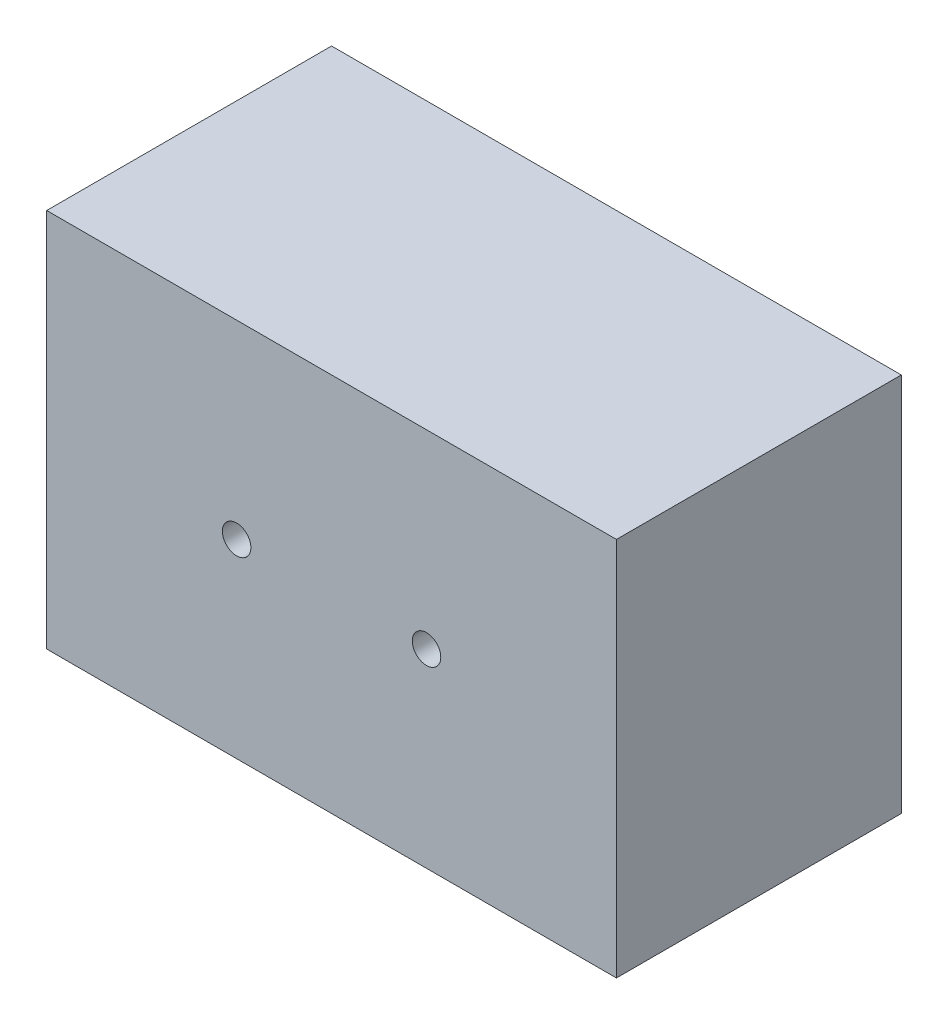
ISO-10303-21;
HEADER;
FILE_DESCRIPTION(('STEP AP214'),'2;1');
FILE_NAME('part.step','',(''),(''),'','','');
FILE_SCHEMA(('AUTOMOTIVE_DESIGN { 1 0 10303 214 1 1 1 1 }'));
ENDSEC;
DATA;
#1=APPLICATION_CONTEXT('core data for automotive mechanical design processes');
#2=APPLICATION_PROTOCOL_DEFINITION('international standard','automotive_design',2000,#1);
#3=PRODUCT_CONTEXT('',#1,'mechanical');
#4=PRODUCT('Part','Part','',(#3));
#5=PRODUCT_RELATED_PRODUCT_CATEGORY('part','',(#4));
#6=PRODUCT_DEFINITION_FORMATION('','',#4);
#7=PRODUCT_DEFINITION_CONTEXT('part definition',#1,'design');
#8=PRODUCT_DEFINITION('design','',#6,#7);
#9=PRODUCT_DEFINITION_SHAPE('','',#8);
#10=(LENGTH_UNIT() NAMED_UNIT(*) SI_UNIT(.MILLI.,.METRE.));
#11=(NAMED_UNIT(*) PLANE_ANGLE_UNIT() SI_UNIT($,.RADIAN.));
#12=(NAMED_UNIT(*) SI_UNIT($,.STERADIAN.) SOLID_ANGLE_UNIT());
#13=UNCERTAINTY_MEASURE_WITH_UNIT(LENGTH_MEASURE(1.E-05),#10,'distance_accuracy_value','');
#14=(GEOMETRIC_REPRESENTATION_CONTEXT(3) GLOBAL_UNCERTAINTY_ASSIGNED_CONTEXT((#13)) GLOBAL_UNIT_ASSIGNED_CONTEXT((#10,
#11,#12)) REPRESENTATION_CONTEXT('',''));
#15=CARTESIAN_POINT('',(0.,0.,0.));
#16=DIRECTION('',(0.,0.,1.));
#17=DIRECTION('',(1.,0.,0.));
#18=AXIS2_PLACEMENT_3D('',#15,#16,#17);
#19=CARTESIAN_POINT('',(10.,0.,0.));
#20=DIRECTION('',(0.,0.,-1.));
#21=DIRECTION('',(1.,0.,0.));
#22=AXIS2_PLACEMENT_3D('',#19,#20,#21);
#23=CYLINDRICAL_SURFACE('',#22,1.5);
#24=CARTESIAN_POINT('',(10.,0.,0.));
#25=DIRECTION('',(0.,0.,1.));
#26=DIRECTION('',(1.,0.,0.));
#27=AXIS2_PLACEMENT_3D('',#24,#25,#26);
#28=CIRCLE('',#27,1.5);
#29=CARTESIAN_POINT('',(11.5,0.,0.));
#30=VERTEX_POINT('',#29);
#31=EDGE_CURVE('E99',#30,#30,#28,.T.);
#32=ORIENTED_EDGE('',*,*,#31,.F.);
#33=DIRECTION('',(0.,0.,1.));
#34=VECTOR('',#33,1.);
#35=CARTESIAN_POINT('',(11.5,0.,0.));
#36=LINE('',#35,#34);
#37=CARTESIAN_POINT('',(11.5,0.,30.));
#38=VERTEX_POINT('',#37);
#39=EDGE_CURVE('E10',#30,#38,#36,.T.);
#40=ORIENTED_EDGE('',*,*,#39,.T.);
#41=CARTESIAN_POINT('',(10.,0.,30.));
#42=DIRECTION('',(0.,0.,-1.));
#43=DIRECTION('',(1.,0.,0.));
#44=AXIS2_PLACEMENT_3D('',#41,#42,#43);
#45=CIRCLE('',#44,1.5);
#46=EDGE_CURVE('E124',#38,#38,#45,.T.);
#47=ORIENTED_EDGE('',*,*,#46,.F.);
#48=ORIENTED_EDGE('',*,*,#39,.F.);
#49=EDGE_LOOP('',(#32,#40,#47,#48));
#50=FACE_BOUND('',#49,.T.);
#51=ADVANCED_FACE('F16',(#50),#23,.F.);
#52=CARTESIAN_POINT('',(-10.,0.,0.));
#53=DIRECTION('',(0.,0.,-1.));
#54=DIRECTION('',(1.,0.,0.));
#55=AXIS2_PLACEMENT_3D('',#52,#53,#54);
#56=CYLINDRICAL_SURFACE('',#55,1.5);
#57=CARTESIAN_POINT('',(-10.,0.,0.));
#58=DIRECTION('',(0.,0.,1.));
#59=DIRECTION('',(1.,0.,0.));
#60=AXIS2_PLACEMENT_3D('',#57,#58,#59);
#61=CIRCLE('',#60,1.5);
#62=CARTESIAN_POINT('',(-8.5,0.,0.));
#63=VERTEX_POINT('',#62);
#64=EDGE_CURVE('E129',#63,#63,#61,.T.);
#65=ORIENTED_EDGE('',*,*,#64,.F.);
#66=DIRECTION('',(0.,0.,1.));
#67=VECTOR('',#66,1.);
#68=CARTESIAN_POINT('',(-8.5,0.,0.));
#69=LINE('',#68,#67);
#70=CARTESIAN_POINT('',(-8.5,0.,30.));
#71=VERTEX_POINT('',#70);
#72=EDGE_CURVE('E25',#63,#71,#69,.T.);
#73=ORIENTED_EDGE('',*,*,#72,.T.);
#74=CARTESIAN_POINT('',(-10.,0.,30.));
#75=DIRECTION('',(0.,0.,-1.));
#76=DIRECTION('',(1.,0.,0.));
#77=AXIS2_PLACEMENT_3D('',#74,#75,#76);
#78=CIRCLE('',#77,1.5);
#79=EDGE_CURVE('E98',#71,#71,#78,.T.);
#80=ORIENTED_EDGE('',*,*,#79,.F.);
#81=ORIENTED_EDGE('',*,*,#72,.F.);
#82=EDGE_LOOP('',(#65,#73,#80,#81));
#83=FACE_BOUND('',#82,.T.);
#84=ADVANCED_FACE('F18',(#83),#56,.F.);
#85=CARTESIAN_POINT('',(30.,20.,0.));
#86=DIRECTION('',(0.,-1.,0.));
#87=DIRECTION('',(0.,0.,-1.));
#88=AXIS2_PLACEMENT_3D('',#85,#86,#87);
#89=PLANE('',#88);
#90=DIRECTION('',(-1.,0.,0.));
#91=VECTOR('',#90,1.);
#92=CARTESIAN_POINT('',(30.,20.,0.));
#93=LINE('',#92,#91);
#94=CARTESIAN_POINT('',(30.,20.,0.));
#95=VERTEX_POINT('',#94);
#96=CARTESIAN_POINT('',(-30.,20.,0.));
#97=VERTEX_POINT('',#96);
#98=EDGE_CURVE('E104',#95,#97,#93,.T.);
#99=ORIENTED_EDGE('',*,*,#98,.T.);
#100=DIRECTION('',(0.,0.,1.));
#101=VECTOR('',#100,1.);
#102=CARTESIAN_POINT('',(-30.,20.,0.));
#103=LINE('',#102,#101);
#104=CARTESIAN_POINT('',(-30.,20.,30.));
#105=VERTEX_POINT('',#104);
#106=EDGE_CURVE('E102',#97,#105,#103,.T.);
#107=ORIENTED_EDGE('',*,*,#106,.T.);
#108=DIRECTION('',(-1.,0.,0.));
#109=VECTOR('',#108,1.);
#110=CARTESIAN_POINT('',(30.,20.,30.));
#111=LINE('',#110,#109);
#112=CARTESIAN_POINT('',(30.,20.,30.));
#113=VERTEX_POINT('',#112);
#114=EDGE_CURVE('E86',#113,#105,#111,.T.);
#115=ORIENTED_EDGE('',*,*,#114,.F.);
#116=DIRECTION('',(0.,0.,1.));
#117=VECTOR('',#116,1.);
#118=CARTESIAN_POINT('',(30.,20.,0.));
#119=LINE('',#118,#117);
#120=EDGE_CURVE('E130',#95,#113,#119,.T.);
#121=ORIENTED_EDGE('',*,*,#120,.F.);
#122=EDGE_LOOP('',(#99,#107,#115,#121));
#123=FACE_BOUND('',#122,.T.);
#124=ADVANCED_FACE('F103',(#123),#89,.F.);
#125=CARTESIAN_POINT('',(0.,0.,30.));
#126=DIRECTION('',(0.,0.,1.));
#127=DIRECTION('',(1.,0.,0.));
#128=AXIS2_PLACEMENT_3D('',#125,#126,#127);
#129=PLANE('',#128);
#130=ORIENTED_EDGE('',*,*,#46,.T.);
#131=EDGE_LOOP('',(#130));
#132=FACE_BOUND('',#131,.T.);
#133=ORIENTED_EDGE('',*,*,#79,.T.);
#134=EDGE_LOOP('',(#133));
#135=FACE_BOUND('',#134,.T.);
#136=DIRECTION('',(1.,0.,0.));
#137=VECTOR('',#136,1.);
#138=CARTESIAN_POINT('',(-30.,-20.,30.));
#139=LINE('',#138,#137);
#140=CARTESIAN_POINT('',(-30.,-20.,30.));
#141=VERTEX_POINT('',#140);
#142=CARTESIAN_POINT('',(30.,-20.,30.));
#143=VERTEX_POINT('',#142);
#144=EDGE_CURVE('E223',#141,#143,#139,.T.);
#145=ORIENTED_EDGE('',*,*,#144,.T.);
#146=DIRECTION('',(0.,1.,0.));
#147=VECTOR('',#146,1.);
#148=CARTESIAN_POINT('',(30.,-20.,30.));
#149=LINE('',#148,#147);
#150=EDGE_CURVE('E93',#143,#113,#149,.T.);
#151=ORIENTED_EDGE('',*,*,#150,.T.);
#152=ORIENTED_EDGE('',*,*,#114,.T.);
#153=DIRECTION('',(0.,-1.,0.));
#154=VECTOR('',#153,1.);
#155=CARTESIAN_POINT('',(-30.,20.,30.));
#156=LINE('',#155,#154);
#157=EDGE_CURVE('E91',#105,#141,#156,.T.);
#158=ORIENTED_EDGE('',*,*,#157,.T.);
#159=EDGE_LOOP('',(#145,#151,#152,#158));
#160=FACE_BOUND('',#159,.T.);
#161=ADVANCED_FACE('F89',(#132,#135,#160),#129,.T.);
#162=CARTESIAN_POINT('',(0.,0.,0.));
#163=DIRECTION('',(0.,0.,1.));
#164=DIRECTION('',(1.,0.,0.));
#165=AXIS2_PLACEMENT_3D('',#162,#163,#164);
#166=PLANE('',#165);
#167=ORIENTED_EDGE('',*,*,#31,.T.);
#168=EDGE_LOOP('',(#167));
#169=FACE_BOUND('',#168,.T.);
#170=ORIENTED_EDGE('',*,*,#64,.T.);
#171=EDGE_LOOP('',(#170));
#172=FACE_BOUND('',#171,.T.);
#173=DIRECTION('',(0.,-1.,0.));
#174=VECTOR('',#173,1.);
#175=CARTESIAN_POINT('',(-30.,20.,0.));
#176=LINE('',#175,#174);
#177=CARTESIAN_POINT('',(-30.,-20.,0.));
#178=VERTEX_POINT('',#177);
#179=EDGE_CURVE('E115',#97,#178,#176,.T.);
#180=ORIENTED_EDGE('',*,*,#179,.F.);
#181=ORIENTED_EDGE('',*,*,#98,.F.);
#182=DIRECTION('',(0.,1.,0.));
#183=VECTOR('',#182,1.);
#184=CARTESIAN_POINT('',(30.,-20.,0.));
#185=LINE('',#184,#183);
#186=CARTESIAN_POINT('',(30.,-20.,0.));
#187=VERTEX_POINT('',#186);
#188=EDGE_CURVE('E108',#187,#95,#185,.T.);
#189=ORIENTED_EDGE('',*,*,#188,.F.);
#190=DIRECTION('',(1.,0.,0.));
#191=VECTOR('',#190,1.);
#192=CARTESIAN_POINT('',(-30.,-20.,0.));
#193=LINE('',#192,#191);
#194=EDGE_CURVE('E221',#178,#187,#193,.T.);
#195=ORIENTED_EDGE('',*,*,#194,.F.);
#196=EDGE_LOOP('',(#180,#181,#189,#195));
#197=FACE_BOUND('',#196,.T.);
#198=ADVANCED_FACE('F166',(#169,#172,#197),#166,.F.);
#199=CARTESIAN_POINT('',(30.,-20.,0.));
#200=DIRECTION('',(-1.,0.,0.));
#201=DIRECTION('',(0.,0.,1.));
#202=AXIS2_PLACEMENT_3D('',#199,#200,#201);
#203=PLANE('',#202);
#204=ORIENTED_EDGE('',*,*,#188,.T.);
#205=ORIENTED_EDGE('',*,*,#120,.T.);
#206=ORIENTED_EDGE('',*,*,#150,.F.);
#207=DIRECTION('',(0.,0.,1.));
#208=VECTOR('',#207,1.);
#209=CARTESIAN_POINT('',(30.,-20.,0.));
#210=LINE('',#209,#208);
#211=EDGE_CURVE('E227',#187,#143,#210,.T.);
#212=ORIENTED_EDGE('',*,*,#211,.F.);
#213=EDGE_LOOP('',(#204,#205,#206,#212));
#214=FACE_BOUND('',#213,.T.);
#215=ADVANCED_FACE('F158',(#214),#203,.F.);
#216=CARTESIAN_POINT('',(-30.,20.,0.));
#217=DIRECTION('',(1.,0.,0.));
#218=DIRECTION('',(0.,1.,0.));
#219=AXIS2_PLACEMENT_3D('',#216,#217,#218);
#220=PLANE('',#219);
#221=ORIENTED_EDGE('',*,*,#179,.T.);
#222=DIRECTION('',(0.,0.,1.));
#223=VECTOR('',#222,1.);
#224=CARTESIAN_POINT('',(-30.,-20.,0.));
#225=LINE('',#224,#223);
#226=EDGE_CURVE('E112',#178,#141,#225,.T.);
#227=ORIENTED_EDGE('',*,*,#226,.T.);
#228=ORIENTED_EDGE('',*,*,#157,.F.);
#229=ORIENTED_EDGE('',*,*,#106,.F.);
#230=EDGE_LOOP('',(#221,#227,#228,#229));
#231=FACE_BOUND('',#230,.T.);
#232=ADVANCED_FACE('F110',(#231),#220,.F.);
#233=CARTESIAN_POINT('',(-30.,-20.,0.));
#234=DIRECTION('',(0.,1.,0.));
#235=DIRECTION('',(1.,0.,0.));
#236=AXIS2_PLACEMENT_3D('',#233,#234,#235);
#237=PLANE('',#236);
#238=ORIENTED_EDGE('',*,*,#194,.T.);
#239=ORIENTED_EDGE('',*,*,#211,.T.);
#240=ORIENTED_EDGE('',*,*,#144,.F.);
#241=ORIENTED_EDGE('',*,*,#226,.F.);
#242=EDGE_LOOP('',(#238,#239,#240,#241));
#243=FACE_BOUND('',#242,.T.);
#244=ADVANCED_FACE('F144',(#243),#237,.F.);
#245=CLOSED_SHELL('',(#51,#84,#124,#161,#198,#215,#232,#244));
#246=MANIFOLD_SOLID_BREP('B1',#245);
#247=ADVANCED_BREP_SHAPE_REPRESENTATION('',(#18,#246),#14);
#248=SHAPE_DEFINITION_REPRESENTATION(#9,#247);
ENDSEC;
END-ISO-10303-21;
